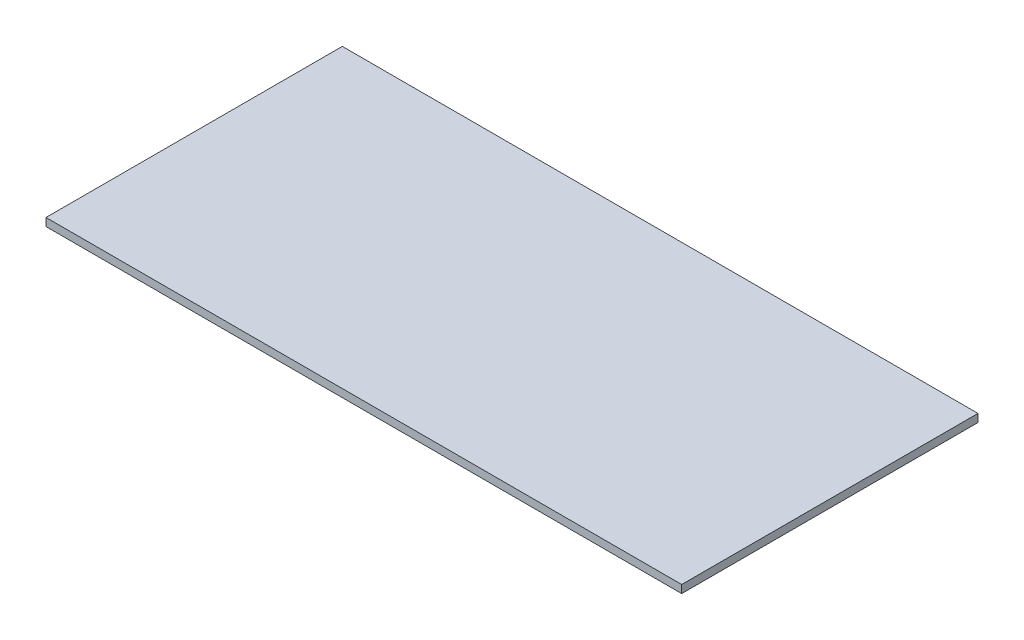
ISO-10303-21;
HEADER;
FILE_DESCRIPTION(('STEP AP214'),'2;1');
FILE_NAME('part.step','',(''),(''),'','','');
FILE_SCHEMA(('AUTOMOTIVE_DESIGN { 1 0 10303 214 1 1 1 1 }'));
ENDSEC;
DATA;
#1=APPLICATION_CONTEXT('core data for automotive mechanical design processes');
#2=APPLICATION_PROTOCOL_DEFINITION('international standard','automotive_design',2000,#1);
#3=PRODUCT_CONTEXT('',#1,'mechanical');
#4=PRODUCT('Part','Part','',(#3));
#5=PRODUCT_RELATED_PRODUCT_CATEGORY('part','',(#4));
#6=PRODUCT_DEFINITION_FORMATION('','',#4);
#7=PRODUCT_DEFINITION_CONTEXT('part definition',#1,'design');
#8=PRODUCT_DEFINITION('design','',#6,#7);
#9=PRODUCT_DEFINITION_SHAPE('','',#8);
#10=(LENGTH_UNIT() NAMED_UNIT(*) SI_UNIT(.MILLI.,.METRE.));
#11=(NAMED_UNIT(*) PLANE_ANGLE_UNIT() SI_UNIT($,.RADIAN.));
#12=(NAMED_UNIT(*) SI_UNIT($,.STERADIAN.) SOLID_ANGLE_UNIT());
#13=UNCERTAINTY_MEASURE_WITH_UNIT(LENGTH_MEASURE(1.E-05),#10,'distance_accuracy_value','');
#14=(GEOMETRIC_REPRESENTATION_CONTEXT(3) GLOBAL_UNCERTAINTY_ASSIGNED_CONTEXT((#13)) GLOBAL_UNIT_ASSIGNED_CONTEXT((#10,
#11,#12)) REPRESENTATION_CONTEXT('',''));
#15=CARTESIAN_POINT('',(0.,0.,0.));
#16=DIRECTION('',(0.,0.,1.));
#17=DIRECTION('',(1.,0.,0.));
#18=AXIS2_PLACEMENT_3D('',#15,#16,#17);
#19=CARTESIAN_POINT('',(16.0899999999999,0.4,7.49999999999998));
#20=DIRECTION('',(-1.,0.,0.));
#21=DIRECTION('',(0.,0.,1.));
#22=AXIS2_PLACEMENT_3D('',#19,#20,#21);
#23=PLANE('',#22);
#24=DIRECTION('',(0.,0.,-1.));
#25=VECTOR('',#24,1.);
#26=CARTESIAN_POINT('',(16.0899999999999,0.,7.49999999999998));
#27=LINE('',#26,#25);
#28=CARTESIAN_POINT('',(16.0899999999999,0.,7.49999999999998));
#29=VERTEX_POINT('',#28);
#30=CARTESIAN_POINT('',(16.0899999999999,0.,-7.50000000000003));
#31=VERTEX_POINT('',#30);
#32=EDGE_CURVE('E113',#29,#31,#27,.T.);
#33=ORIENTED_EDGE('',*,*,#32,.T.);
#34=DIRECTION('',(0.,-1.,0.));
#35=VECTOR('',#34,1.);
#36=CARTESIAN_POINT('',(16.0899999999999,0.4,-7.50000000000003));
#37=LINE('',#36,#35);
#38=CARTESIAN_POINT('',(16.0899999999999,0.4,-7.50000000000003));
#39=VERTEX_POINT('',#38);
#40=EDGE_CURVE('E11',#39,#31,#37,.T.);
#41=ORIENTED_EDGE('',*,*,#40,.F.);
#42=DIRECTION('',(0.,0.,-1.));
#43=VECTOR('',#42,1.);
#44=CARTESIAN_POINT('',(16.0899999999999,0.4,7.49999999999998));
#45=LINE('',#44,#43);
#46=CARTESIAN_POINT('',(16.0899999999999,0.4,7.49999999999998));
#47=VERTEX_POINT('',#46);
#48=EDGE_CURVE('E97',#47,#39,#45,.T.);
#49=ORIENTED_EDGE('',*,*,#48,.F.);
#50=DIRECTION('',(0.,-1.,0.));
#51=VECTOR('',#50,1.);
#52=CARTESIAN_POINT('',(16.0899999999999,0.4,7.49999999999998));
#53=LINE('',#52,#51);
#54=EDGE_CURVE('E109',#47,#29,#53,.T.);
#55=ORIENTED_EDGE('',*,*,#54,.T.);
#56=EDGE_LOOP('',(#33,#41,#49,#55));
#57=FACE_BOUND('',#56,.T.);
#58=ADVANCED_FACE('F45',(#57),#23,.F.);
#59=CARTESIAN_POINT('',(-16.0900000000001,0.4,-7.50000000000003));
#60=DIRECTION('',(0.,0.,1.));
#61=DIRECTION('',(1.,0.,0.));
#62=AXIS2_PLACEMENT_3D('',#59,#60,#61);
#63=PLANE('',#62);
#64=DIRECTION('',(-1.,0.,0.));
#65=VECTOR('',#64,1.);
#66=CARTESIAN_POINT('',(-16.0900000000001,0.,-7.50000000000003));
#67=LINE('',#66,#65);
#68=CARTESIAN_POINT('',(-16.0900000000001,0.,-7.50000000000003));
#69=VERTEX_POINT('',#68);
#70=EDGE_CURVE('E102',#31,#69,#67,.T.);
#71=ORIENTED_EDGE('',*,*,#70,.T.);
#72=DIRECTION('',(0.,-1.,0.));
#73=VECTOR('',#72,1.);
#74=CARTESIAN_POINT('',(-16.0900000000001,0.4,-7.50000000000003));
#75=LINE('',#74,#73);
#76=CARTESIAN_POINT('',(-16.0900000000001,0.4,-7.50000000000003));
#77=VERTEX_POINT('',#76);
#78=EDGE_CURVE('E54',#77,#69,#75,.T.);
#79=ORIENTED_EDGE('',*,*,#78,.F.);
#80=DIRECTION('',(-1.,0.,0.));
#81=VECTOR('',#80,1.);
#82=CARTESIAN_POINT('',(-16.0900000000001,0.4,-7.50000000000003));
#83=LINE('',#82,#81);
#84=EDGE_CURVE('E92',#39,#77,#83,.T.);
#85=ORIENTED_EDGE('',*,*,#84,.F.);
#86=ORIENTED_EDGE('',*,*,#40,.T.);
#87=EDGE_LOOP('',(#71,#79,#85,#86));
#88=FACE_BOUND('',#87,.T.);
#89=ADVANCED_FACE('F101',(#88),#63,.F.);
#90=CARTESIAN_POINT('',(-16.0900000000001,0.4,7.49999999999998));
#91=DIRECTION('',(1.,0.,0.));
#92=DIRECTION('',(0.,0.,-1.));
#93=AXIS2_PLACEMENT_3D('',#90,#91,#92);
#94=PLANE('',#93);
#95=DIRECTION('',(0.,0.,1.));
#96=VECTOR('',#95,1.);
#97=CARTESIAN_POINT('',(-16.0900000000001,0.,7.49999999999998));
#98=LINE('',#97,#96);
#99=CARTESIAN_POINT('',(-16.0900000000001,0.,7.49999999999998));
#100=VERTEX_POINT('',#99);
#101=EDGE_CURVE('E79',#69,#100,#98,.T.);
#102=ORIENTED_EDGE('',*,*,#101,.T.);
#103=DIRECTION('',(0.,-1.,0.));
#104=VECTOR('',#103,1.);
#105=CARTESIAN_POINT('',(-16.0900000000001,0.4,7.49999999999998));
#106=LINE('',#105,#104);
#107=CARTESIAN_POINT('',(-16.0900000000001,0.4,7.49999999999998));
#108=VERTEX_POINT('',#107);
#109=EDGE_CURVE('E104',#108,#100,#106,.T.);
#110=ORIENTED_EDGE('',*,*,#109,.F.);
#111=DIRECTION('',(0.,0.,1.));
#112=VECTOR('',#111,1.);
#113=CARTESIAN_POINT('',(-16.0900000000001,0.4,7.49999999999998));
#114=LINE('',#113,#112);
#115=EDGE_CURVE('E95',#77,#108,#114,.T.);
#116=ORIENTED_EDGE('',*,*,#115,.F.);
#117=ORIENTED_EDGE('',*,*,#78,.T.);
#118=EDGE_LOOP('',(#102,#110,#116,#117));
#119=FACE_BOUND('',#118,.T.);
#120=ADVANCED_FACE('F105',(#119),#94,.F.);
#121=CARTESIAN_POINT('',(-16.0900000000001,0.4,7.49999999999998));
#122=DIRECTION('',(0.,0.,-1.));
#123=DIRECTION('',(-1.,0.,0.));
#124=AXIS2_PLACEMENT_3D('',#121,#122,#123);
#125=PLANE('',#124);
#126=DIRECTION('',(1.,0.,0.));
#127=VECTOR('',#126,1.);
#128=CARTESIAN_POINT('',(-16.0900000000001,0.,7.49999999999998));
#129=LINE('',#128,#127);
#130=EDGE_CURVE('E85',#100,#29,#129,.T.);
#131=ORIENTED_EDGE('',*,*,#130,.T.);
#132=ORIENTED_EDGE('',*,*,#54,.F.);
#133=DIRECTION('',(1.,0.,0.));
#134=VECTOR('',#133,1.);
#135=CARTESIAN_POINT('',(-16.0900000000001,0.4,7.49999999999998));
#136=LINE('',#135,#134);
#137=EDGE_CURVE('E62',#108,#47,#136,.T.);
#138=ORIENTED_EDGE('',*,*,#137,.F.);
#139=ORIENTED_EDGE('',*,*,#109,.T.);
#140=EDGE_LOOP('',(#131,#132,#138,#139));
#141=FACE_BOUND('',#140,.T.);
#142=ADVANCED_FACE('F126',(#141),#125,.F.);
#143=CARTESIAN_POINT('',(0.,0.4,0.));
#144=DIRECTION('',(0.,-1.,0.));
#145=DIRECTION('',(0.,0.,-1.));
#146=AXIS2_PLACEMENT_3D('',#143,#144,#145);
#147=PLANE('',#146);
#148=ORIENTED_EDGE('',*,*,#48,.T.);
#149=ORIENTED_EDGE('',*,*,#84,.T.);
#150=ORIENTED_EDGE('',*,*,#115,.T.);
#151=ORIENTED_EDGE('',*,*,#137,.T.);
#152=EDGE_LOOP('',(#148,#149,#150,#151));
#153=FACE_BOUND('',#152,.T.);
#154=ADVANCED_FACE('F93',(#153),#147,.F.);
#155=CARTESIAN_POINT('',(0.,0.,0.));
#156=DIRECTION('',(0.,-1.,0.));
#157=DIRECTION('',(0.,0.,-1.));
#158=AXIS2_PLACEMENT_3D('',#155,#156,#157);
#159=PLANE('',#158);
#160=ORIENTED_EDGE('',*,*,#32,.F.);
#161=ORIENTED_EDGE('',*,*,#130,.F.);
#162=ORIENTED_EDGE('',*,*,#101,.F.);
#163=ORIENTED_EDGE('',*,*,#70,.F.);
#164=EDGE_LOOP('',(#160,#161,#162,#163));
#165=FACE_BOUND('',#164,.T.);
#166=ADVANCED_FACE('F129',(#165),#159,.T.);
#167=CLOSED_SHELL('',(#58,#89,#120,#142,#154,#166));
#168=MANIFOLD_SOLID_BREP('B2',#167);
#169=ADVANCED_BREP_SHAPE_REPRESENTATION('',(#18,#168),#14);
#170=SHAPE_DEFINITION_REPRESENTATION(#9,#169);
ENDSEC;
END-ISO-10303-21;
